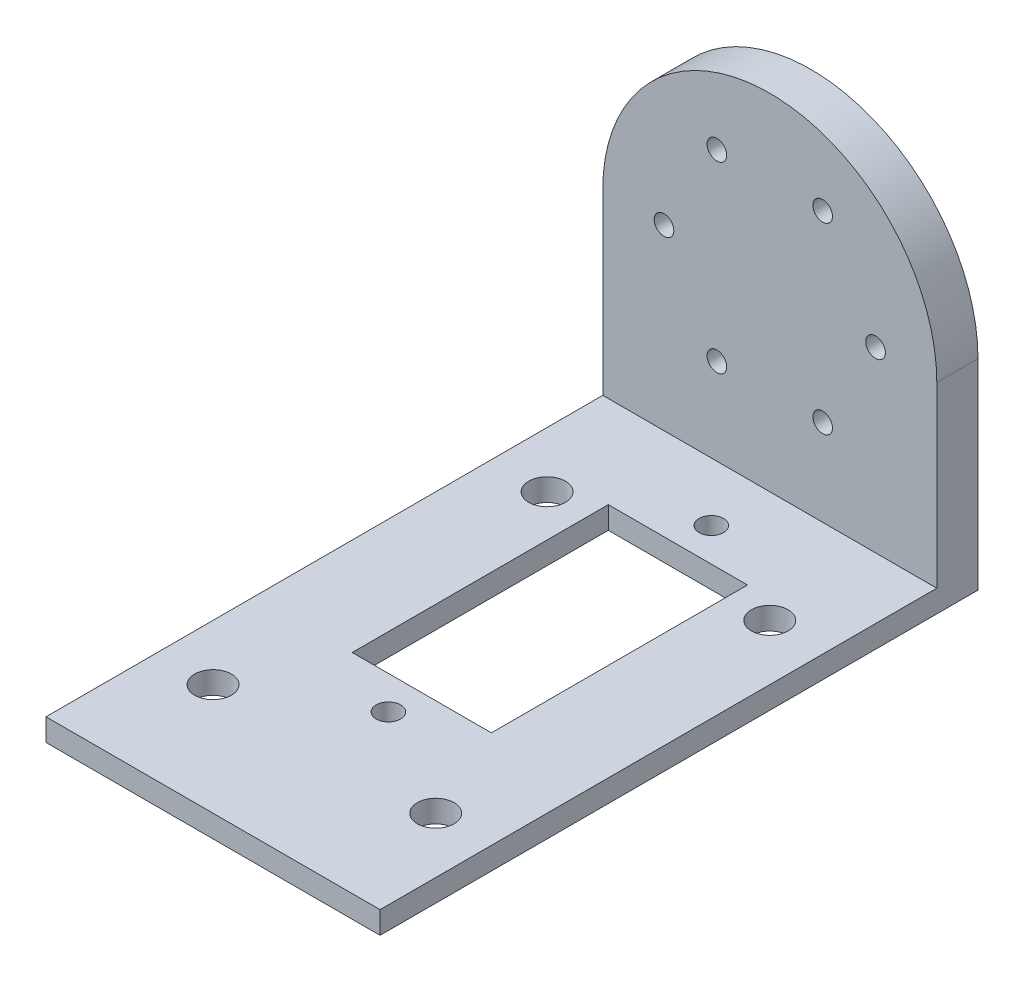
ISO-10303-21;
HEADER;
FILE_DESCRIPTION(('STEP AP214'),'2;1');
FILE_NAME('part.step','',(''),(''),'','','');
FILE_SCHEMA(('AUTOMOTIVE_DESIGN { 1 0 10303 214 1 1 1 1 }'));
ENDSEC;
DATA;
#1=APPLICATION_CONTEXT('core data for automotive mechanical design processes');
#2=APPLICATION_PROTOCOL_DEFINITION('international standard','automotive_design',2000,#1);
#3=PRODUCT_CONTEXT('',#1,'mechanical');
#4=PRODUCT('Part','Part','',(#3));
#5=PRODUCT_RELATED_PRODUCT_CATEGORY('part','',(#4));
#6=PRODUCT_DEFINITION_FORMATION('','',#4);
#7=PRODUCT_DEFINITION_CONTEXT('part definition',#1,'design');
#8=PRODUCT_DEFINITION('design','',#6,#7);
#9=PRODUCT_DEFINITION_SHAPE('','',#8);
#10=(LENGTH_UNIT() NAMED_UNIT(*) SI_UNIT(.MILLI.,.METRE.));
#11=(NAMED_UNIT(*) PLANE_ANGLE_UNIT() SI_UNIT($,.RADIAN.));
#12=(NAMED_UNIT(*) SI_UNIT($,.STERADIAN.) SOLID_ANGLE_UNIT());
#13=UNCERTAINTY_MEASURE_WITH_UNIT(LENGTH_MEASURE(1.E-05),#10,'distance_accuracy_value','');
#14=(GEOMETRIC_REPRESENTATION_CONTEXT(3) GLOBAL_UNCERTAINTY_ASSIGNED_CONTEXT((#13)) GLOBAL_UNIT_ASSIGNED_CONTEXT((#10,
#11,#12)) REPRESENTATION_CONTEXT('',''));
#15=CARTESIAN_POINT('',(0.,0.,0.));
#16=DIRECTION('',(0.,0.,1.));
#17=DIRECTION('',(1.,0.,0.));
#18=AXIS2_PLACEMENT_3D('',#15,#16,#17);
#19=CARTESIAN_POINT('',(0.,0.,3.7));
#20=DIRECTION('',(0.,0.,-1.));
#21=DIRECTION('',(-1.,0.,0.));
#22=AXIS2_PLACEMENT_3D('',#19,#20,#21);
#23=PLANE('',#22);
#24=CARTESIAN_POINT('',(4.7500000000001,8.22724133595211,3.7));
#25=DIRECTION('',(0.,0.,1.));
#26=DIRECTION('',(1.,0.,0.));
#27=AXIS2_PLACEMENT_3D('',#24,#25,#26);
#28=CIRCLE('',#27,0.88);
#29=CARTESIAN_POINT('',(5.6300000000001,8.22724133595211,3.7));
#30=VERTEX_POINT('',#29);
#31=EDGE_CURVE('E232',#30,#30,#28,.T.);
#32=ORIENTED_EDGE('',*,*,#31,.F.);
#33=EDGE_LOOP('',(#32));
#34=FACE_BOUND('',#33,.T.);
#35=CARTESIAN_POINT('',(-4.74999999999992,8.22724133595221,3.7));
#36=DIRECTION('',(0.,0.,1.));
#37=DIRECTION('',(1.,0.,0.));
#38=AXIS2_PLACEMENT_3D('',#35,#36,#37);
#39=CIRCLE('',#38,0.88);
#40=CARTESIAN_POINT('',(-3.86999999999992,8.22724133595221,3.7));
#41=VERTEX_POINT('',#40);
#42=EDGE_CURVE('E238',#41,#41,#39,.T.);
#43=ORIENTED_EDGE('',*,*,#42,.F.);
#44=EDGE_LOOP('',(#43));
#45=FACE_BOUND('',#44,.T.);
#46=CARTESIAN_POINT('',(-9.5,0.,3.7));
#47=DIRECTION('',(0.,0.,1.));
#48=DIRECTION('',(1.,0.,0.));
#49=AXIS2_PLACEMENT_3D('',#46,#47,#48);
#50=CIRCLE('',#49,0.88);
#51=CARTESIAN_POINT('',(-8.62,0.,3.7));
#52=VERTEX_POINT('',#51);
#53=EDGE_CURVE('E244',#52,#52,#50,.T.);
#54=ORIENTED_EDGE('',*,*,#53,.F.);
#55=EDGE_LOOP('',(#54));
#56=FACE_BOUND('',#55,.T.);
#57=CARTESIAN_POINT('',(-4.75000000000004,-8.22724133595215,3.7));
#58=DIRECTION('',(0.,0.,1.));
#59=DIRECTION('',(1.,0.,0.));
#60=AXIS2_PLACEMENT_3D('',#57,#58,#59);
#61=CIRCLE('',#60,0.88);
#62=CARTESIAN_POINT('',(-3.87000000000004,-8.22724133595215,3.7));
#63=VERTEX_POINT('',#62);
#64=EDGE_CURVE('E250',#63,#63,#61,.T.);
#65=ORIENTED_EDGE('',*,*,#64,.F.);
#66=EDGE_LOOP('',(#65));
#67=FACE_BOUND('',#66,.T.);
#68=CARTESIAN_POINT('',(4.74999999999998,-8.22724133595218,3.7));
#69=DIRECTION('',(0.,0.,1.));
#70=DIRECTION('',(1.,0.,0.));
#71=AXIS2_PLACEMENT_3D('',#68,#69,#70);
#72=CIRCLE('',#71,0.88);
#73=CARTESIAN_POINT('',(5.62999999999998,-8.22724133595218,3.7));
#74=VERTEX_POINT('',#73);
#75=EDGE_CURVE('E256',#74,#74,#72,.T.);
#76=ORIENTED_EDGE('',*,*,#75,.F.);
#77=EDGE_LOOP('',(#76));
#78=FACE_BOUND('',#77,.T.);
#79=CARTESIAN_POINT('',(9.5,0.,3.7));
#80=DIRECTION('',(0.,0.,1.));
#81=DIRECTION('',(1.,0.,0.));
#82=AXIS2_PLACEMENT_3D('',#79,#80,#81);
#83=CIRCLE('',#82,0.88);
#84=CARTESIAN_POINT('',(10.38,0.,3.7));
#85=VERTEX_POINT('',#84);
#86=EDGE_CURVE('E97',#85,#85,#83,.T.);
#87=ORIENTED_EDGE('',*,*,#86,.F.);
#88=EDGE_LOOP('',(#87));
#89=FACE_BOUND('',#88,.T.);
#90=DIRECTION('',(-1.,0.,0.));
#91=VECTOR('',#90,1.);
#92=CARTESIAN_POINT('',(-15.,-16.,3.7));
#93=LINE('',#92,#91);
#94=CARTESIAN_POINT('',(15.,-16.,3.7));
#95=VERTEX_POINT('',#94);
#96=CARTESIAN_POINT('',(-15.,-16.,3.7));
#97=VERTEX_POINT('',#96);
#98=EDGE_CURVE('E50',#95,#97,#93,.T.);
#99=ORIENTED_EDGE('',*,*,#98,.F.);
#100=DIRECTION('',(0.,1.,0.));
#101=VECTOR('',#100,1.);
#102=CARTESIAN_POINT('',(15.,-18.,3.7));
#103=LINE('',#102,#101);
#104=CARTESIAN_POINT('',(15.,0.,3.7));
#105=VERTEX_POINT('',#104);
#106=EDGE_CURVE('E55',#95,#105,#103,.T.);
#107=ORIENTED_EDGE('',*,*,#106,.T.);
#108=CARTESIAN_POINT('',(0.,0.,3.7));
#109=DIRECTION('',(0.,0.,1.));
#110=DIRECTION('',(-1.,0.,0.));
#111=AXIS2_PLACEMENT_3D('',#108,#109,#110);
#112=CIRCLE('',#111,15.);
#113=CARTESIAN_POINT('',(-15.,0.,3.7));
#114=VERTEX_POINT('',#113);
#115=EDGE_CURVE('E86',#105,#114,#112,.T.);
#116=ORIENTED_EDGE('',*,*,#115,.T.);
#117=DIRECTION('',(0.,-1.,0.));
#118=VECTOR('',#117,1.);
#119=CARTESIAN_POINT('',(-15.,0.,3.7));
#120=LINE('',#119,#118);
#121=EDGE_CURVE('E263',#114,#97,#120,.T.);
#122=ORIENTED_EDGE('',*,*,#121,.T.);
#123=EDGE_LOOP('',(#99,#107,#116,#122));
#124=FACE_BOUND('',#123,.T.);
#125=ADVANCED_FACE('F35',(#34,#45,#56,#67,#78,#89,#124),#23,.F.);
#126=CARTESIAN_POINT('',(0.,0.,0.));
#127=DIRECTION('',(0.,0.,-1.));
#128=DIRECTION('',(-1.,0.,0.));
#129=AXIS2_PLACEMENT_3D('',#126,#127,#128);
#130=PLANE('',#129);
#131=CARTESIAN_POINT('',(-4.74999999999992,8.22724133595221,0.));
#132=DIRECTION('',(0.,0.,1.));
#133=DIRECTION('',(1.,0.,0.));
#134=AXIS2_PLACEMENT_3D('',#131,#132,#133);
#135=CIRCLE('',#134,0.88);
#136=CARTESIAN_POINT('',(-3.86999999999992,8.22724133595221,0.));
#137=VERTEX_POINT('',#136);
#138=EDGE_CURVE('E235',#137,#137,#135,.T.);
#139=ORIENTED_EDGE('',*,*,#138,.T.);
#140=EDGE_LOOP('',(#139));
#141=FACE_BOUND('',#140,.T.);
#142=CARTESIAN_POINT('',(-4.75000000000004,-8.22724133595215,0.));
#143=DIRECTION('',(0.,0.,1.));
#144=DIRECTION('',(1.,0.,0.));
#145=AXIS2_PLACEMENT_3D('',#142,#143,#144);
#146=CIRCLE('',#145,0.88);
#147=CARTESIAN_POINT('',(-3.87000000000004,-8.22724133595215,0.));
#148=VERTEX_POINT('',#147);
#149=EDGE_CURVE('E247',#148,#148,#146,.T.);
#150=ORIENTED_EDGE('',*,*,#149,.T.);
#151=EDGE_LOOP('',(#150));
#152=FACE_BOUND('',#151,.T.);
#153=CARTESIAN_POINT('',(9.5,0.,0.));
#154=DIRECTION('',(0.,0.,1.));
#155=DIRECTION('',(1.,0.,0.));
#156=AXIS2_PLACEMENT_3D('',#153,#154,#155);
#157=CIRCLE('',#156,0.88);
#158=CARTESIAN_POINT('',(10.38,0.,0.));
#159=VERTEX_POINT('',#158);
#160=EDGE_CURVE('E101',#159,#159,#157,.T.);
#161=ORIENTED_EDGE('',*,*,#160,.T.);
#162=EDGE_LOOP('',(#161));
#163=FACE_BOUND('',#162,.T.);
#164=CARTESIAN_POINT('',(0.,0.,0.));
#165=DIRECTION('',(0.,0.,1.));
#166=DIRECTION('',(-1.,0.,0.));
#167=AXIS2_PLACEMENT_3D('',#164,#165,#166);
#168=CIRCLE('',#167,15.);
#169=CARTESIAN_POINT('',(15.,0.,0.));
#170=VERTEX_POINT('',#169);
#171=CARTESIAN_POINT('',(-15.,0.,0.));
#172=VERTEX_POINT('',#171);
#173=EDGE_CURVE('E92',#170,#172,#168,.T.);
#174=ORIENTED_EDGE('',*,*,#173,.F.);
#175=DIRECTION('',(0.,1.,0.));
#176=VECTOR('',#175,1.);
#177=CARTESIAN_POINT('',(15.,-18.,0.));
#178=LINE('',#177,#176);
#179=CARTESIAN_POINT('',(15.,-18.,0.));
#180=VERTEX_POINT('',#179);
#181=EDGE_CURVE('E75',#180,#170,#178,.T.);
#182=ORIENTED_EDGE('',*,*,#181,.F.);
#183=DIRECTION('',(1.,0.,0.));
#184=VECTOR('',#183,1.);
#185=CARTESIAN_POINT('',(-15.,-18.,0.));
#186=LINE('',#185,#184);
#187=CARTESIAN_POINT('',(-15.,-18.,0.));
#188=VERTEX_POINT('',#187);
#189=EDGE_CURVE('E87',#188,#180,#186,.T.);
#190=ORIENTED_EDGE('',*,*,#189,.F.);
#191=DIRECTION('',(0.,-1.,0.));
#192=VECTOR('',#191,1.);
#193=CARTESIAN_POINT('',(-15.,0.,0.));
#194=LINE('',#193,#192);
#195=EDGE_CURVE('E96',#172,#188,#194,.T.);
#196=ORIENTED_EDGE('',*,*,#195,.F.);
#197=EDGE_LOOP('',(#174,#182,#190,#196));
#198=FACE_BOUND('',#197,.T.);
#199=CARTESIAN_POINT('',(4.74999999999998,-8.22724133595218,0.));
#200=DIRECTION('',(0.,0.,1.));
#201=DIRECTION('',(1.,0.,0.));
#202=AXIS2_PLACEMENT_3D('',#199,#200,#201);
#203=CIRCLE('',#202,0.88);
#204=CARTESIAN_POINT('',(5.62999999999998,-8.22724133595218,0.));
#205=VERTEX_POINT('',#204);
#206=EDGE_CURVE('E253',#205,#205,#203,.T.);
#207=ORIENTED_EDGE('',*,*,#206,.T.);
#208=EDGE_LOOP('',(#207));
#209=FACE_BOUND('',#208,.T.);
#210=CARTESIAN_POINT('',(-9.5,0.,0.));
#211=DIRECTION('',(0.,0.,1.));
#212=DIRECTION('',(1.,0.,0.));
#213=AXIS2_PLACEMENT_3D('',#210,#211,#212);
#214=CIRCLE('',#213,0.88);
#215=CARTESIAN_POINT('',(-8.62,0.,0.));
#216=VERTEX_POINT('',#215);
#217=EDGE_CURVE('E241',#216,#216,#214,.T.);
#218=ORIENTED_EDGE('',*,*,#217,.T.);
#219=EDGE_LOOP('',(#218));
#220=FACE_BOUND('',#219,.T.);
#221=CARTESIAN_POINT('',(4.7500000000001,8.22724133595211,0.));
#222=DIRECTION('',(0.,0.,1.));
#223=DIRECTION('',(1.,0.,0.));
#224=AXIS2_PLACEMENT_3D('',#221,#222,#223);
#225=CIRCLE('',#224,0.88);
#226=CARTESIAN_POINT('',(5.6300000000001,8.22724133595211,0.));
#227=VERTEX_POINT('',#226);
#228=EDGE_CURVE('E231',#227,#227,#225,.T.);
#229=ORIENTED_EDGE('',*,*,#228,.T.);
#230=EDGE_LOOP('',(#229));
#231=FACE_BOUND('',#230,.T.);
#232=ADVANCED_FACE('F94',(#141,#152,#163,#198,#209,#220,#231),#130,.T.);
#233=CARTESIAN_POINT('',(0.,0.,3.7));
#234=DIRECTION('',(0.,0.,-1.));
#235=DIRECTION('',(-1.,0.,0.));
#236=AXIS2_PLACEMENT_3D('',#233,#234,#235);
#237=CYLINDRICAL_SURFACE('',#236,15.);
#238=ORIENTED_EDGE('',*,*,#173,.T.);
#239=DIRECTION('',(0.,0.,-1.));
#240=VECTOR('',#239,1.);
#241=CARTESIAN_POINT('',(-15.,0.,3.7));
#242=LINE('',#241,#240);
#243=EDGE_CURVE('E11',#114,#172,#242,.T.);
#244=ORIENTED_EDGE('',*,*,#243,.F.);
#245=ORIENTED_EDGE('',*,*,#115,.F.);
#246=DIRECTION('',(0.,0.,-1.));
#247=VECTOR('',#246,1.);
#248=CARTESIAN_POINT('',(15.,0.,3.7));
#249=LINE('',#248,#247);
#250=EDGE_CURVE('E78',#105,#170,#249,.T.);
#251=ORIENTED_EDGE('',*,*,#250,.T.);
#252=EDGE_LOOP('',(#238,#244,#245,#251));
#253=FACE_BOUND('',#252,.T.);
#254=ADVANCED_FACE('F37',(#253),#237,.T.);
#255=CARTESIAN_POINT('',(-15.,0.,3.7));
#256=DIRECTION('',(1.,0.,0.));
#257=DIRECTION('',(0.,1.,0.));
#258=AXIS2_PLACEMENT_3D('',#255,#256,#257);
#259=PLANE('',#258);
#260=ORIENTED_EDGE('',*,*,#195,.T.);
#261=DIRECTION('',(0.,0.,-1.));
#262=VECTOR('',#261,1.);
#263=CARTESIAN_POINT('',(-15.,-18.,3.7));
#264=LINE('',#263,#262);
#265=CARTESIAN_POINT('',(-15.,-18.,53.7));
#266=VERTEX_POINT('',#265);
#267=EDGE_CURVE('E43',#266,#188,#264,.T.);
#268=ORIENTED_EDGE('',*,*,#267,.F.);
#269=DIRECTION('',(0.,-1.,0.));
#270=VECTOR('',#269,1.);
#271=CARTESIAN_POINT('',(-15.,-16.,53.7));
#272=LINE('',#271,#270);
#273=CARTESIAN_POINT('',(-15.,-16.,53.7));
#274=VERTEX_POINT('',#273);
#275=EDGE_CURVE('E122',#274,#266,#272,.T.);
#276=ORIENTED_EDGE('',*,*,#275,.F.);
#277=DIRECTION('',(0.,0.,1.));
#278=VECTOR('',#277,1.);
#279=CARTESIAN_POINT('',(-15.,-16.,53.7));
#280=LINE('',#279,#278);
#281=EDGE_CURVE('E217',#97,#274,#280,.T.);
#282=ORIENTED_EDGE('',*,*,#281,.F.);
#283=ORIENTED_EDGE('',*,*,#121,.F.);
#284=ORIENTED_EDGE('',*,*,#243,.T.);
#285=EDGE_LOOP('',(#260,#268,#276,#282,#283,#284));
#286=FACE_BOUND('',#285,.T.);
#287=ADVANCED_FACE('F119',(#286),#259,.F.);
#288=CARTESIAN_POINT('',(-15.,-18.,3.7));
#289=DIRECTION('',(0.,1.,0.));
#290=DIRECTION('',(0.,0.,1.));
#291=AXIS2_PLACEMENT_3D('',#288,#289,#290);
#292=PLANE('',#291);
#293=ORIENTED_EDGE('',*,*,#189,.T.);
#294=DIRECTION('',(0.,0.,-1.));
#295=VECTOR('',#294,1.);
#296=CARTESIAN_POINT('',(15.,-18.,3.7));
#297=LINE('',#296,#295);
#298=CARTESIAN_POINT('',(15.,-18.,53.7));
#299=VERTEX_POINT('',#298);
#300=EDGE_CURVE('E82',#299,#180,#297,.T.);
#301=ORIENTED_EDGE('',*,*,#300,.F.);
#302=DIRECTION('',(1.,0.,0.));
#303=VECTOR('',#302,1.);
#304=CARTESIAN_POINT('',(15.,-18.,53.7));
#305=LINE('',#304,#303);
#306=EDGE_CURVE('E115',#266,#299,#305,.T.);
#307=ORIENTED_EDGE('',*,*,#306,.F.);
#308=ORIENTED_EDGE('',*,*,#267,.T.);
#309=EDGE_LOOP('',(#293,#301,#307,#308));
#310=FACE_BOUND('',#309,.T.);
#311=CARTESIAN_POINT('',(0.,-18.,8.95));
#312=DIRECTION('',(0.,1.,0.));
#313=DIRECTION('',(0.,0.,1.));
#314=AXIS2_PLACEMENT_3D('',#311,#312,#313);
#315=CIRCLE('',#314,1.1);
#316=CARTESIAN_POINT('',(0.,-18.,10.05));
#317=VERTEX_POINT('',#316);
#318=EDGE_CURVE('E175',#317,#317,#315,.T.);
#319=ORIENTED_EDGE('',*,*,#318,.T.);
#320=EDGE_LOOP('',(#319));
#321=FACE_BOUND('',#320,.T.);
#322=CARTESIAN_POINT('',(10.,-18.,43.7));
#323=DIRECTION('',(0.,1.,0.));
#324=DIRECTION('',(0.,0.,1.));
#325=AXIS2_PLACEMENT_3D('',#322,#323,#324);
#326=CIRCLE('',#325,1.65);
#327=CARTESIAN_POINT('',(10.,-18.,45.35));
#328=VERTEX_POINT('',#327);
#329=EDGE_CURVE('E197',#328,#328,#326,.T.);
#330=ORIENTED_EDGE('',*,*,#329,.T.);
#331=EDGE_LOOP('',(#330));
#332=FACE_BOUND('',#331,.T.);
#333=CARTESIAN_POINT('',(-10.,-18.,13.7));
#334=DIRECTION('',(0.,1.,0.));
#335=DIRECTION('',(0.,0.,1.));
#336=AXIS2_PLACEMENT_3D('',#333,#334,#335);
#337=CIRCLE('',#336,1.65);
#338=CARTESIAN_POINT('',(-10.,-18.,15.35));
#339=VERTEX_POINT('',#338);
#340=EDGE_CURVE('E209',#339,#339,#337,.T.);
#341=ORIENTED_EDGE('',*,*,#340,.T.);
#342=EDGE_LOOP('',(#341));
#343=FACE_BOUND('',#342,.T.);
#344=CARTESIAN_POINT('',(10.,-18.,13.7));
#345=DIRECTION('',(0.,1.,0.));
#346=DIRECTION('',(0.,0.,-1.));
#347=AXIS2_PLACEMENT_3D('',#344,#345,#346);
#348=CIRCLE('',#347,1.65);
#349=CARTESIAN_POINT('',(10.,-18.,12.05));
#350=VERTEX_POINT('',#349);
#351=EDGE_CURVE('E203',#350,#350,#348,.T.);
#352=ORIENTED_EDGE('',*,*,#351,.T.);
#353=EDGE_LOOP('',(#352));
#354=FACE_BOUND('',#353,.T.);
#355=CARTESIAN_POINT('',(-10.,-18.,43.7));
#356=DIRECTION('',(0.,1.,0.));
#357=DIRECTION('',(0.,0.,-1.));
#358=AXIS2_PLACEMENT_3D('',#355,#356,#357);
#359=CIRCLE('',#358,1.65);
#360=CARTESIAN_POINT('',(-10.,-18.,42.05));
#361=VERTEX_POINT('',#360);
#362=EDGE_CURVE('E193',#361,#361,#359,.T.);
#363=ORIENTED_EDGE('',*,*,#362,.T.);
#364=EDGE_LOOP('',(#363));
#365=FACE_BOUND('',#364,.T.);
#366=DIRECTION('',(0.,0.,1.));
#367=VECTOR('',#366,1.);
#368=CARTESIAN_POINT('',(-6.25,-18.,28.7));
#369=LINE('',#368,#367);
#370=CARTESIAN_POINT('',(-6.25,-18.,11.95));
#371=VERTEX_POINT('',#370);
#372=CARTESIAN_POINT('',(-6.25,-18.,34.95));
#373=VERTEX_POINT('',#372);
#374=EDGE_CURVE('E150',#371,#373,#369,.T.);
#375=ORIENTED_EDGE('',*,*,#374,.T.);
#376=DIRECTION('',(1.,0.,0.));
#377=VECTOR('',#376,1.);
#378=CARTESIAN_POINT('',(-6.25,-18.,34.95));
#379=LINE('',#378,#377);
#380=CARTESIAN_POINT('',(6.25,-18.,34.95));
#381=VERTEX_POINT('',#380);
#382=EDGE_CURVE('E179',#373,#381,#379,.T.);
#383=ORIENTED_EDGE('',*,*,#382,.T.);
#384=DIRECTION('',(0.,0.,-1.));
#385=VECTOR('',#384,1.);
#386=CARTESIAN_POINT('',(6.25,-18.,28.7));
#387=LINE('',#386,#385);
#388=CARTESIAN_POINT('',(6.25,-18.,11.95));
#389=VERTEX_POINT('',#388);
#390=EDGE_CURVE('E182',#381,#389,#387,.T.);
#391=ORIENTED_EDGE('',*,*,#390,.T.);
#392=DIRECTION('',(-1.,0.,0.));
#393=VECTOR('',#392,1.);
#394=CARTESIAN_POINT('',(-6.25,-18.,11.95));
#395=LINE('',#394,#393);
#396=EDGE_CURVE('E172',#389,#371,#395,.T.);
#397=ORIENTED_EDGE('',*,*,#396,.T.);
#398=EDGE_LOOP('',(#375,#383,#391,#397));
#399=FACE_BOUND('',#398,.T.);
#400=CARTESIAN_POINT('',(0.,-18.,37.95));
#401=DIRECTION('',(0.,1.,0.));
#402=DIRECTION('',(0.,0.,1.));
#403=AXIS2_PLACEMENT_3D('',#400,#401,#402);
#404=CIRCLE('',#403,1.1);
#405=CARTESIAN_POINT('',(0.,-18.,39.05));
#406=VERTEX_POINT('',#405);
#407=EDGE_CURVE('E290',#406,#406,#404,.T.);
#408=ORIENTED_EDGE('',*,*,#407,.T.);
#409=EDGE_LOOP('',(#408));
#410=FACE_BOUND('',#409,.T.);
#411=ADVANCED_FACE('F111',(#310,#321,#332,#343,#354,#365,#399,#410),#292,.F.);
#412=CARTESIAN_POINT('',(15.,-18.,3.7));
#413=DIRECTION('',(-1.,0.,0.));
#414=DIRECTION('',(0.,-1.,0.));
#415=AXIS2_PLACEMENT_3D('',#412,#413,#414);
#416=PLANE('',#415);
#417=ORIENTED_EDGE('',*,*,#181,.T.);
#418=ORIENTED_EDGE('',*,*,#250,.F.);
#419=ORIENTED_EDGE('',*,*,#106,.F.);
#420=DIRECTION('',(0.,0.,-1.));
#421=VECTOR('',#420,1.);
#422=CARTESIAN_POINT('',(15.,-16.,3.7));
#423=LINE('',#422,#421);
#424=CARTESIAN_POINT('',(15.,-16.,53.7));
#425=VERTEX_POINT('',#424);
#426=EDGE_CURVE('E223',#425,#95,#423,.T.);
#427=ORIENTED_EDGE('',*,*,#426,.F.);
#428=DIRECTION('',(0.,-1.,0.));
#429=VECTOR('',#428,1.);
#430=CARTESIAN_POINT('',(15.,-16.,53.7));
#431=LINE('',#430,#429);
#432=EDGE_CURVE('E227',#425,#299,#431,.T.);
#433=ORIENTED_EDGE('',*,*,#432,.T.);
#434=ORIENTED_EDGE('',*,*,#300,.T.);
#435=EDGE_LOOP('',(#417,#418,#419,#427,#433,#434));
#436=FACE_BOUND('',#435,.T.);
#437=ADVANCED_FACE('F77',(#436),#416,.F.);
#438=CARTESIAN_POINT('',(9.5,0.,3.7));
#439=DIRECTION('',(0.,0.,-1.));
#440=DIRECTION('',(-1.,0.,0.));
#441=AXIS2_PLACEMENT_3D('',#438,#439,#440);
#442=CYLINDRICAL_SURFACE('',#441,0.88);
#443=ORIENTED_EDGE('',*,*,#86,.T.);
#444=EDGE_LOOP('',(#443));
#445=FACE_BOUND('',#444,.T.);
#446=ORIENTED_EDGE('',*,*,#160,.F.);
#447=EDGE_LOOP('',(#446));
#448=FACE_BOUND('',#447,.T.);
#449=ADVANCED_FACE('F325',(#445,#448),#442,.F.);
#450=CARTESIAN_POINT('',(4.74999999999998,-8.22724133595218,3.7));
#451=DIRECTION('',(0.,0.,-1.));
#452=DIRECTION('',(-1.,0.,0.));
#453=AXIS2_PLACEMENT_3D('',#450,#451,#452);
#454=CYLINDRICAL_SURFACE('',#453,0.88);
#455=ORIENTED_EDGE('',*,*,#75,.T.);
#456=EDGE_LOOP('',(#455));
#457=FACE_BOUND('',#456,.T.);
#458=ORIENTED_EDGE('',*,*,#206,.F.);
#459=EDGE_LOOP('',(#458));
#460=FACE_BOUND('',#459,.T.);
#461=ADVANCED_FACE('F373',(#457,#460),#454,.F.);
#462=CARTESIAN_POINT('',(-4.75000000000004,-8.22724133595215,3.7));
#463=DIRECTION('',(0.,0.,-1.));
#464=DIRECTION('',(-1.,0.,0.));
#465=AXIS2_PLACEMENT_3D('',#462,#463,#464);
#466=CYLINDRICAL_SURFACE('',#465,0.88);
#467=ORIENTED_EDGE('',*,*,#64,.T.);
#468=EDGE_LOOP('',(#467));
#469=FACE_BOUND('',#468,.T.);
#470=ORIENTED_EDGE('',*,*,#149,.F.);
#471=EDGE_LOOP('',(#470));
#472=FACE_BOUND('',#471,.T.);
#473=ADVANCED_FACE('F381',(#469,#472),#466,.F.);
#474=CARTESIAN_POINT('',(-9.5,0.,3.7));
#475=DIRECTION('',(0.,0.,-1.));
#476=DIRECTION('',(-1.,0.,0.));
#477=AXIS2_PLACEMENT_3D('',#474,#475,#476);
#478=CYLINDRICAL_SURFACE('',#477,0.88);
#479=ORIENTED_EDGE('',*,*,#53,.T.);
#480=EDGE_LOOP('',(#479));
#481=FACE_BOUND('',#480,.T.);
#482=ORIENTED_EDGE('',*,*,#217,.F.);
#483=EDGE_LOOP('',(#482));
#484=FACE_BOUND('',#483,.T.);
#485=ADVANCED_FACE('F389',(#481,#484),#478,.F.);
#486=CARTESIAN_POINT('',(-4.74999999999992,8.22724133595221,3.7));
#487=DIRECTION('',(0.,0.,-1.));
#488=DIRECTION('',(-1.,0.,0.));
#489=AXIS2_PLACEMENT_3D('',#486,#487,#488);
#490=CYLINDRICAL_SURFACE('',#489,0.88);
#491=ORIENTED_EDGE('',*,*,#42,.T.);
#492=EDGE_LOOP('',(#491));
#493=FACE_BOUND('',#492,.T.);
#494=ORIENTED_EDGE('',*,*,#138,.F.);
#495=EDGE_LOOP('',(#494));
#496=FACE_BOUND('',#495,.T.);
#497=ADVANCED_FACE('F398',(#493,#496),#490,.F.);
#498=CARTESIAN_POINT('',(4.7500000000001,8.22724133595211,3.7));
#499=DIRECTION('',(0.,0.,-1.));
#500=DIRECTION('',(-1.,0.,0.));
#501=AXIS2_PLACEMENT_3D('',#498,#499,#500);
#502=CYLINDRICAL_SURFACE('',#501,0.88);
#503=ORIENTED_EDGE('',*,*,#31,.T.);
#504=EDGE_LOOP('',(#503));
#505=FACE_BOUND('',#504,.T.);
#506=ORIENTED_EDGE('',*,*,#228,.F.);
#507=EDGE_LOOP('',(#506));
#508=FACE_BOUND('',#507,.T.);
#509=ADVANCED_FACE('F407',(#505,#508),#502,.F.);
#510=CARTESIAN_POINT('',(0.,-16.,0.));
#511=DIRECTION('',(0.,-1.,0.));
#512=DIRECTION('',(0.,0.,-1.));
#513=AXIS2_PLACEMENT_3D('',#510,#511,#512);
#514=PLANE('',#513);
#515=CARTESIAN_POINT('',(-10.,-16.,43.7));
#516=DIRECTION('',(0.,1.,0.));
#517=DIRECTION('',(0.,0.,-1.));
#518=AXIS2_PLACEMENT_3D('',#515,#516,#517);
#519=CIRCLE('',#518,1.65);
#520=CARTESIAN_POINT('',(-10.,-16.,42.05));
#521=VERTEX_POINT('',#520);
#522=EDGE_CURVE('E194',#521,#521,#519,.T.);
#523=ORIENTED_EDGE('',*,*,#522,.F.);
#524=EDGE_LOOP('',(#523));
#525=FACE_BOUND('',#524,.T.);
#526=CARTESIAN_POINT('',(10.,-16.,43.7));
#527=DIRECTION('',(0.,1.,0.));
#528=DIRECTION('',(0.,0.,1.));
#529=AXIS2_PLACEMENT_3D('',#526,#527,#528);
#530=CIRCLE('',#529,1.65);
#531=CARTESIAN_POINT('',(10.,-16.,45.35));
#532=VERTEX_POINT('',#531);
#533=EDGE_CURVE('E200',#532,#532,#530,.T.);
#534=ORIENTED_EDGE('',*,*,#533,.F.);
#535=EDGE_LOOP('',(#534));
#536=FACE_BOUND('',#535,.T.);
#537=CARTESIAN_POINT('',(10.,-16.,13.7));
#538=DIRECTION('',(0.,1.,0.));
#539=DIRECTION('',(0.,0.,-1.));
#540=AXIS2_PLACEMENT_3D('',#537,#538,#539);
#541=CIRCLE('',#540,1.65);
#542=CARTESIAN_POINT('',(10.,-16.,12.05));
#543=VERTEX_POINT('',#542);
#544=EDGE_CURVE('E206',#543,#543,#541,.T.);
#545=ORIENTED_EDGE('',*,*,#544,.F.);
#546=EDGE_LOOP('',(#545));
#547=FACE_BOUND('',#546,.T.);
#548=CARTESIAN_POINT('',(-10.,-16.,13.7));
#549=DIRECTION('',(0.,1.,0.));
#550=DIRECTION('',(0.,0.,1.));
#551=AXIS2_PLACEMENT_3D('',#548,#549,#550);
#552=CIRCLE('',#551,1.65);
#553=CARTESIAN_POINT('',(-10.,-16.,15.35));
#554=VERTEX_POINT('',#553);
#555=EDGE_CURVE('E212',#554,#554,#552,.T.);
#556=ORIENTED_EDGE('',*,*,#555,.F.);
#557=EDGE_LOOP('',(#556));
#558=FACE_BOUND('',#557,.T.);
#559=ORIENTED_EDGE('',*,*,#281,.T.);
#560=DIRECTION('',(1.,0.,0.));
#561=VECTOR('',#560,1.);
#562=CARTESIAN_POINT('',(15.,-16.,53.7));
#563=LINE('',#562,#561);
#564=EDGE_CURVE('E220',#274,#425,#563,.T.);
#565=ORIENTED_EDGE('',*,*,#564,.T.);
#566=ORIENTED_EDGE('',*,*,#426,.T.);
#567=ORIENTED_EDGE('',*,*,#98,.T.);
#568=EDGE_LOOP('',(#559,#565,#566,#567));
#569=FACE_BOUND('',#568,.T.);
#570=DIRECTION('',(1.,0.,0.));
#571=VECTOR('',#570,1.);
#572=CARTESIAN_POINT('',(-6.25,-16.,34.95));
#573=LINE('',#572,#571);
#574=CARTESIAN_POINT('',(-6.25,-16.,34.95));
#575=VERTEX_POINT('',#574);
#576=CARTESIAN_POINT('',(6.25,-16.,34.95));
#577=VERTEX_POINT('',#576);
#578=EDGE_CURVE('E169',#575,#577,#573,.T.);
#579=ORIENTED_EDGE('',*,*,#578,.F.);
#580=DIRECTION('',(0.,0.,1.));
#581=VECTOR('',#580,1.);
#582=CARTESIAN_POINT('',(-6.25,-16.,28.7));
#583=LINE('',#582,#581);
#584=CARTESIAN_POINT('',(-6.25,-16.,11.95));
#585=VERTEX_POINT('',#584);
#586=EDGE_CURVE('E146',#585,#575,#583,.T.);
#587=ORIENTED_EDGE('',*,*,#586,.F.);
#588=DIRECTION('',(-1.,0.,0.));
#589=VECTOR('',#588,1.);
#590=CARTESIAN_POINT('',(-6.25,-16.,11.95));
#591=LINE('',#590,#589);
#592=CARTESIAN_POINT('',(6.25,-16.,11.95));
#593=VERTEX_POINT('',#592);
#594=EDGE_CURVE('E155',#593,#585,#591,.T.);
#595=ORIENTED_EDGE('',*,*,#594,.F.);
#596=DIRECTION('',(0.,0.,-1.));
#597=VECTOR('',#596,1.);
#598=CARTESIAN_POINT('',(6.25,-16.,28.7));
#599=LINE('',#598,#597);
#600=EDGE_CURVE('E163',#577,#593,#599,.T.);
#601=ORIENTED_EDGE('',*,*,#600,.F.);
#602=EDGE_LOOP('',(#579,#587,#595,#601));
#603=FACE_BOUND('',#602,.T.);
#604=CARTESIAN_POINT('',(0.,-16.,8.95));
#605=DIRECTION('',(0.,1.,0.));
#606=DIRECTION('',(0.,0.,1.));
#607=AXIS2_PLACEMENT_3D('',#604,#605,#606);
#608=CIRCLE('',#607,1.1);
#609=CARTESIAN_POINT('',(0.,-16.,10.05));
#610=VERTEX_POINT('',#609);
#611=EDGE_CURVE('E183',#610,#610,#608,.T.);
#612=ORIENTED_EDGE('',*,*,#611,.F.);
#613=EDGE_LOOP('',(#612));
#614=FACE_BOUND('',#613,.T.);
#615=CARTESIAN_POINT('',(0.,-16.,37.95));
#616=DIRECTION('',(0.,1.,0.));
#617=DIRECTION('',(0.,0.,1.));
#618=AXIS2_PLACEMENT_3D('',#615,#616,#617);
#619=CIRCLE('',#618,1.1);
#620=CARTESIAN_POINT('',(0.,-16.,39.05));
#621=VERTEX_POINT('',#620);
#622=EDGE_CURVE('E292',#621,#621,#619,.T.);
#623=ORIENTED_EDGE('',*,*,#622,.F.);
#624=EDGE_LOOP('',(#623));
#625=FACE_BOUND('',#624,.T.);
#626=ADVANCED_FACE('F166',(#525,#536,#547,#558,#569,#603,#614,#625),#514,.F.);
#627=CARTESIAN_POINT('',(15.,-16.,53.7));
#628=DIRECTION('',(0.,0.,-1.));
#629=DIRECTION('',(-1.,0.,0.));
#630=AXIS2_PLACEMENT_3D('',#627,#628,#629);
#631=PLANE('',#630);
#632=ORIENTED_EDGE('',*,*,#306,.T.);
#633=ORIENTED_EDGE('',*,*,#432,.F.);
#634=ORIENTED_EDGE('',*,*,#564,.F.);
#635=ORIENTED_EDGE('',*,*,#275,.T.);
#636=EDGE_LOOP('',(#632,#633,#634,#635));
#637=FACE_BOUND('',#636,.T.);
#638=ADVANCED_FACE('F430',(#637),#631,.F.);
#639=CARTESIAN_POINT('',(-10.,-16.,13.7));
#640=DIRECTION('',(0.,-1.,0.));
#641=DIRECTION('',(0.,0.,-1.));
#642=AXIS2_PLACEMENT_3D('',#639,#640,#641);
#643=CYLINDRICAL_SURFACE('',#642,1.65);
#644=ORIENTED_EDGE('',*,*,#555,.T.);
#645=EDGE_LOOP('',(#644));
#646=FACE_BOUND('',#645,.T.);
#647=ORIENTED_EDGE('',*,*,#340,.F.);
#648=EDGE_LOOP('',(#647));
#649=FACE_BOUND('',#648,.T.);
#650=ADVANCED_FACE('F440',(#646,#649),#643,.F.);
#651=CARTESIAN_POINT('',(10.,-16.,13.7));
#652=DIRECTION('',(0.,-1.,0.));
#653=DIRECTION('',(0.,0.,-1.));
#654=AXIS2_PLACEMENT_3D('',#651,#652,#653);
#655=CYLINDRICAL_SURFACE('',#654,1.65);
#656=ORIENTED_EDGE('',*,*,#544,.T.);
#657=EDGE_LOOP('',(#656));
#658=FACE_BOUND('',#657,.T.);
#659=ORIENTED_EDGE('',*,*,#351,.F.);
#660=EDGE_LOOP('',(#659));
#661=FACE_BOUND('',#660,.T.);
#662=ADVANCED_FACE('F450',(#658,#661),#655,.F.);
#663=CARTESIAN_POINT('',(10.,-16.,43.7));
#664=DIRECTION('',(0.,-1.,0.));
#665=DIRECTION('',(0.,0.,-1.));
#666=AXIS2_PLACEMENT_3D('',#663,#664,#665);
#667=CYLINDRICAL_SURFACE('',#666,1.65);
#668=ORIENTED_EDGE('',*,*,#533,.T.);
#669=EDGE_LOOP('',(#668));
#670=FACE_BOUND('',#669,.T.);
#671=ORIENTED_EDGE('',*,*,#329,.F.);
#672=EDGE_LOOP('',(#671));
#673=FACE_BOUND('',#672,.T.);
#674=ADVANCED_FACE('F460',(#670,#673),#667,.F.);
#675=CARTESIAN_POINT('',(-10.,-16.,43.7));
#676=DIRECTION('',(0.,-1.,0.));
#677=DIRECTION('',(0.,0.,-1.));
#678=AXIS2_PLACEMENT_3D('',#675,#676,#677);
#679=CYLINDRICAL_SURFACE('',#678,1.65);
#680=ORIENTED_EDGE('',*,*,#522,.T.);
#681=EDGE_LOOP('',(#680));
#682=FACE_BOUND('',#681,.T.);
#683=ORIENTED_EDGE('',*,*,#362,.F.);
#684=EDGE_LOOP('',(#683));
#685=FACE_BOUND('',#684,.T.);
#686=ADVANCED_FACE('F470',(#682,#685),#679,.F.);
#687=CARTESIAN_POINT('',(-6.25,-16.,34.95));
#688=DIRECTION('',(0.,0.,-1.));
#689=DIRECTION('',(-1.,0.,0.));
#690=AXIS2_PLACEMENT_3D('',#687,#688,#689);
#691=PLANE('',#690);
#692=ORIENTED_EDGE('',*,*,#382,.F.);
#693=DIRECTION('',(0.,-1.,0.));
#694=VECTOR('',#693,1.);
#695=CARTESIAN_POINT('',(-6.25,-16.,34.95));
#696=LINE('',#695,#694);
#697=EDGE_CURVE('E191',#575,#373,#696,.T.);
#698=ORIENTED_EDGE('',*,*,#697,.F.);
#699=ORIENTED_EDGE('',*,*,#578,.T.);
#700=DIRECTION('',(0.,-1.,0.));
#701=VECTOR('',#700,1.);
#702=CARTESIAN_POINT('',(6.25,-16.,34.95));
#703=LINE('',#702,#701);
#704=EDGE_CURVE('E188',#577,#381,#703,.T.);
#705=ORIENTED_EDGE('',*,*,#704,.T.);
#706=EDGE_LOOP('',(#692,#698,#699,#705));
#707=FACE_BOUND('',#706,.T.);
#708=ADVANCED_FACE('F281',(#707),#691,.T.);
#709=CARTESIAN_POINT('',(6.25,-16.,28.7));
#710=DIRECTION('',(-1.,0.,0.));
#711=DIRECTION('',(0.,0.,1.));
#712=AXIS2_PLACEMENT_3D('',#709,#710,#711);
#713=PLANE('',#712);
#714=ORIENTED_EDGE('',*,*,#390,.F.);
#715=ORIENTED_EDGE('',*,*,#704,.F.);
#716=ORIENTED_EDGE('',*,*,#600,.T.);
#717=DIRECTION('',(0.,-1.,0.));
#718=VECTOR('',#717,1.);
#719=CARTESIAN_POINT('',(6.25,-16.,11.95));
#720=LINE('',#719,#718);
#721=EDGE_CURVE('E154',#593,#389,#720,.T.);
#722=ORIENTED_EDGE('',*,*,#721,.T.);
#723=EDGE_LOOP('',(#714,#715,#716,#722));
#724=FACE_BOUND('',#723,.T.);
#725=ADVANCED_FACE('F283',(#724),#713,.T.);
#726=CARTESIAN_POINT('',(-6.25,-16.,11.95));
#727=DIRECTION('',(0.,0.,1.));
#728=DIRECTION('',(1.,0.,0.));
#729=AXIS2_PLACEMENT_3D('',#726,#727,#728);
#730=PLANE('',#729);
#731=ORIENTED_EDGE('',*,*,#396,.F.);
#732=ORIENTED_EDGE('',*,*,#721,.F.);
#733=ORIENTED_EDGE('',*,*,#594,.T.);
#734=DIRECTION('',(0.,-1.,0.));
#735=VECTOR('',#734,1.);
#736=CARTESIAN_POINT('',(-6.25,-16.,11.95));
#737=LINE('',#736,#735);
#738=EDGE_CURVE('E141',#585,#371,#737,.T.);
#739=ORIENTED_EDGE('',*,*,#738,.T.);
#740=EDGE_LOOP('',(#731,#732,#733,#739));
#741=FACE_BOUND('',#740,.T.);
#742=ADVANCED_FACE('F159',(#741),#730,.T.);
#743=CARTESIAN_POINT('',(-6.25,-16.,28.7));
#744=DIRECTION('',(1.,0.,0.));
#745=DIRECTION('',(0.,0.,-1.));
#746=AXIS2_PLACEMENT_3D('',#743,#744,#745);
#747=PLANE('',#746);
#748=ORIENTED_EDGE('',*,*,#374,.F.);
#749=ORIENTED_EDGE('',*,*,#738,.F.);
#750=ORIENTED_EDGE('',*,*,#586,.T.);
#751=ORIENTED_EDGE('',*,*,#697,.T.);
#752=EDGE_LOOP('',(#748,#749,#750,#751));
#753=FACE_BOUND('',#752,.T.);
#754=ADVANCED_FACE('F143',(#753),#747,.T.);
#755=CARTESIAN_POINT('',(0.,-16.,8.95));
#756=DIRECTION('',(0.,-1.,0.));
#757=DIRECTION('',(0.,0.,-1.));
#758=AXIS2_PLACEMENT_3D('',#755,#756,#757);
#759=CYLINDRICAL_SURFACE('',#758,1.1);
#760=ORIENTED_EDGE('',*,*,#611,.T.);
#761=EDGE_LOOP('',(#760));
#762=FACE_BOUND('',#761,.T.);
#763=ORIENTED_EDGE('',*,*,#318,.F.);
#764=EDGE_LOOP('',(#763));
#765=FACE_BOUND('',#764,.T.);
#766=ADVANCED_FACE('F303',(#762,#765),#759,.F.);
#767=CARTESIAN_POINT('',(0.,-16.,37.95));
#768=DIRECTION('',(0.,-1.,0.));
#769=DIRECTION('',(0.,0.,-1.));
#770=AXIS2_PLACEMENT_3D('',#767,#768,#769);
#771=CYLINDRICAL_SURFACE('',#770,1.1);
#772=ORIENTED_EDGE('',*,*,#622,.T.);
#773=EDGE_LOOP('',(#772));
#774=FACE_BOUND('',#773,.T.);
#775=ORIENTED_EDGE('',*,*,#407,.F.);
#776=EDGE_LOOP('',(#775));
#777=FACE_BOUND('',#776,.T.);
#778=ADVANCED_FACE('F305',(#774,#777),#771,.F.);
#779=CLOSED_SHELL('',(#125,#232,#254,#287,#411,#437,#449,#461,#473,#485,#497,#509,#626,#638,
#650,#662,#674,#686,#708,#725,#742,#754,#766,#778));
#780=MANIFOLD_SOLID_BREP('B2',#779);
#781=ADVANCED_BREP_SHAPE_REPRESENTATION('',(#18,#780),#14);
#782=SHAPE_DEFINITION_REPRESENTATION(#9,#781);
ENDSEC;
END-ISO-10303-21;
